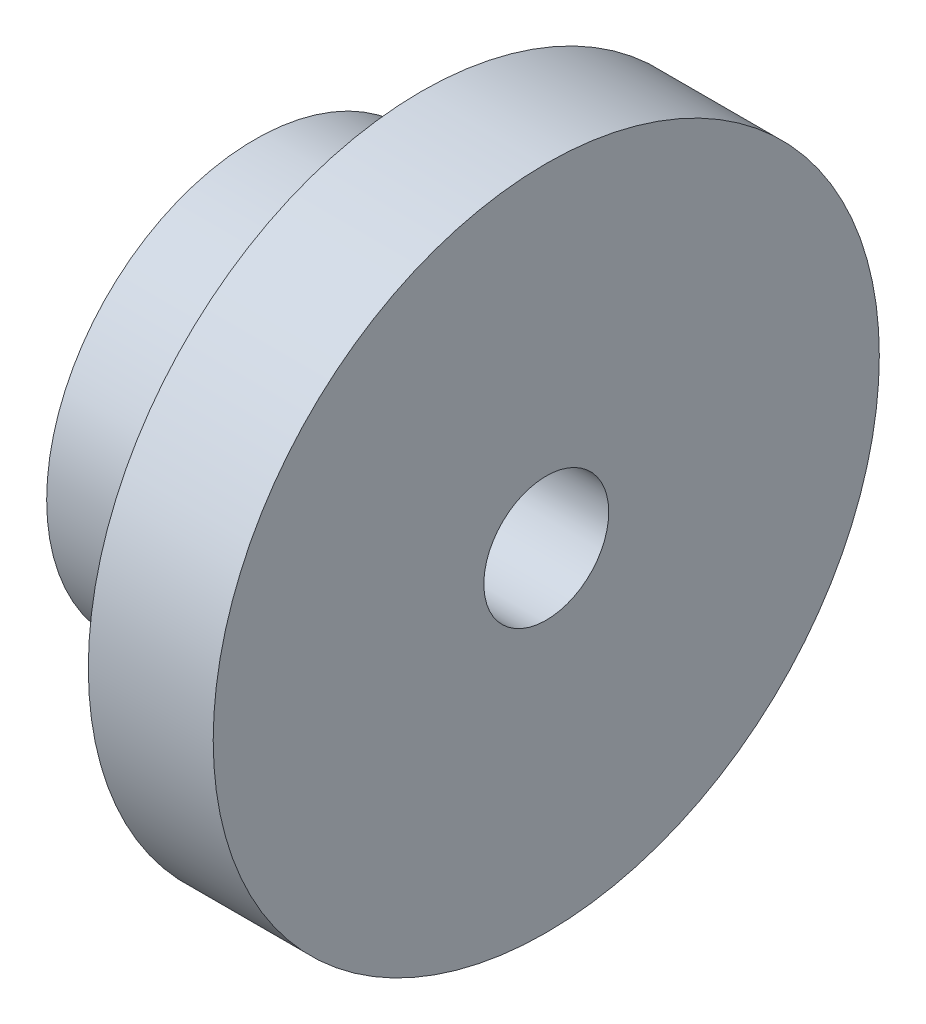
ISO-10303-21;
HEADER;
FILE_DESCRIPTION(('STEP AP214'),'2;1');
FILE_NAME('part.step','',(''),(''),'','','');
FILE_SCHEMA(('AUTOMOTIVE_DESIGN { 1 0 10303 214 1 1 1 1 }'));
ENDSEC;
DATA;
#1=APPLICATION_CONTEXT('core data for automotive mechanical design processes');
#2=APPLICATION_PROTOCOL_DEFINITION('international standard','automotive_design',2000,#1);
#3=PRODUCT_CONTEXT('',#1,'mechanical');
#4=PRODUCT('Part','Part','',(#3));
#5=PRODUCT_RELATED_PRODUCT_CATEGORY('part','',(#4));
#6=PRODUCT_DEFINITION_FORMATION('','',#4);
#7=PRODUCT_DEFINITION_CONTEXT('part definition',#1,'design');
#8=PRODUCT_DEFINITION('design','',#6,#7);
#9=PRODUCT_DEFINITION_SHAPE('','',#8);
#10=(LENGTH_UNIT() NAMED_UNIT(*) SI_UNIT(.MILLI.,.METRE.));
#11=(NAMED_UNIT(*) PLANE_ANGLE_UNIT() SI_UNIT($,.RADIAN.));
#12=(NAMED_UNIT(*) SI_UNIT($,.STERADIAN.) SOLID_ANGLE_UNIT());
#13=UNCERTAINTY_MEASURE_WITH_UNIT(LENGTH_MEASURE(1.E-05),#10,'distance_accuracy_value','');
#14=(GEOMETRIC_REPRESENTATION_CONTEXT(3) GLOBAL_UNCERTAINTY_ASSIGNED_CONTEXT((#13)) GLOBAL_UNIT_ASSIGNED_CONTEXT((#10,
#11,#12)) REPRESENTATION_CONTEXT('',''));
#15=CARTESIAN_POINT('',(0.,0.,0.));
#16=DIRECTION('',(0.,0.,1.));
#17=DIRECTION('',(1.,0.,0.));
#18=AXIS2_PLACEMENT_3D('',#15,#16,#17);
#19=CARTESIAN_POINT('',(0.,0.,0.));
#20=DIRECTION('',(1.,0.,0.));
#21=DIRECTION('',(0.,0.,-1.));
#22=AXIS2_PLACEMENT_3D('',#19,#20,#21);
#23=PLANE('',#22);
#24=CARTESIAN_POINT('',(0.,0.,0.));
#25=DIRECTION('',(1.,0.,0.));
#26=DIRECTION('',(0.,0.,-1.));
#27=AXIS2_PLACEMENT_3D('',#24,#25,#26);
#28=CIRCLE('',#27,12.7);
#29=CARTESIAN_POINT('',(0.,0.,12.7));
#30=VERTEX_POINT('',#29);
#31=EDGE_CURVE('E42',#30,#30,#28,.T.);
#32=ORIENTED_EDGE('',*,*,#31,.F.);
#33=EDGE_LOOP('',(#32));
#34=FACE_BOUND('',#33,.T.);
#35=CARTESIAN_POINT('',(0.,0.,0.));
#36=DIRECTION('',(1.,0.,0.));
#37=DIRECTION('',(0.,0.,-1.));
#38=AXIS2_PLACEMENT_3D('',#35,#36,#37);
#39=CIRCLE('',#38,7.9375);
#40=CARTESIAN_POINT('',(0.,0.,-7.9375));
#41=VERTEX_POINT('',#40);
#42=EDGE_CURVE('E10',#41,#41,#39,.F.);
#43=ORIENTED_EDGE('',*,*,#42,.F.);
#44=EDGE_LOOP('',(#43));
#45=FACE_BOUND('',#44,.T.);
#46=ADVANCED_FACE('F31',(#34,#45),#23,.F.);
#47=CARTESIAN_POINT('',(4.7625,0.,0.));
#48=DIRECTION('',(-1.,0.,0.));
#49=DIRECTION('',(0.,0.,1.));
#50=AXIS2_PLACEMENT_3D('',#47,#48,#49);
#51=CYLINDRICAL_SURFACE('',#50,12.7);
#52=CARTESIAN_POINT('',(4.7625,0.,0.));
#53=DIRECTION('',(1.,0.,0.));
#54=DIRECTION('',(0.,0.,-1.));
#55=AXIS2_PLACEMENT_3D('',#52,#53,#54);
#56=CIRCLE('',#55,12.7);
#57=CARTESIAN_POINT('',(4.7625,0.,12.7));
#58=VERTEX_POINT('',#57);
#59=EDGE_CURVE('E38',#58,#58,#56,.T.);
#60=CARTESIAN_POINT('',(4.7625,0.,12.7));
#61=CARTESIAN_POINT('',(4.712890625,0.,12.7));
#62=CARTESIAN_POINT('',(4.66328125,0.,12.7));
#63=CARTESIAN_POINT('',(4.5640625,0.,12.7));
#64=CARTESIAN_POINT('',(4.514453125,0.,12.7));
#65=CARTESIAN_POINT('',(4.415234375,0.,12.7));
#66=CARTESIAN_POINT('',(4.365625,0.,12.7));
#67=CARTESIAN_POINT('',(4.26640625,0.,12.7));
#68=CARTESIAN_POINT('',(4.216796875,0.,12.7));
#69=CARTESIAN_POINT('',(4.117578125,0.,12.7));
#70=CARTESIAN_POINT('',(4.06796875,0.,12.7));
#71=CARTESIAN_POINT('',(3.96875,0.,12.7));
#72=CARTESIAN_POINT('',(3.919140625,0.,12.7));
#73=CARTESIAN_POINT('',(3.819921875,0.,12.7));
#74=CARTESIAN_POINT('',(3.7703125,0.,12.7));
#75=CARTESIAN_POINT('',(3.67109375,0.,12.7));
#76=CARTESIAN_POINT('',(3.621484375,0.,12.7));
#77=CARTESIAN_POINT('',(3.522265625,0.,12.7));
#78=CARTESIAN_POINT('',(3.47265625,0.,12.7));
#79=CARTESIAN_POINT('',(3.3734375,0.,12.7));
#80=CARTESIAN_POINT('',(3.323828125,0.,12.7));
#81=CARTESIAN_POINT('',(3.224609375,0.,12.7));
#82=CARTESIAN_POINT('',(3.175,0.,12.7));
#83=CARTESIAN_POINT('',(3.07578125,0.,12.7));
#84=CARTESIAN_POINT('',(3.026171875,0.,12.7));
#85=CARTESIAN_POINT('',(2.926953125,0.,12.7));
#86=CARTESIAN_POINT('',(2.87734375,0.,12.7));
#87=CARTESIAN_POINT('',(2.778125,0.,12.7));
#88=CARTESIAN_POINT('',(2.728515625,0.,12.7));
#89=CARTESIAN_POINT('',(2.629296875,0.,12.7));
#90=CARTESIAN_POINT('',(2.5796875,0.,12.7));
#91=CARTESIAN_POINT('',(2.48046875,0.,12.7));
#92=CARTESIAN_POINT('',(2.430859375,0.,12.7));
#93=CARTESIAN_POINT('',(2.331640625,0.,12.7));
#94=CARTESIAN_POINT('',(2.28203125,0.,12.7));
#95=CARTESIAN_POINT('',(2.1828125,0.,12.7));
#96=CARTESIAN_POINT('',(2.133203125,0.,12.7));
#97=CARTESIAN_POINT('',(2.033984375,0.,12.7));
#98=CARTESIAN_POINT('',(1.984375,0.,12.7));
#99=CARTESIAN_POINT('',(1.88515625,0.,12.7));
#100=CARTESIAN_POINT('',(1.835546875,0.,12.7));
#101=CARTESIAN_POINT('',(1.736328125,0.,12.7));
#102=CARTESIAN_POINT('',(1.68671875,0.,12.7));
#103=CARTESIAN_POINT('',(1.5875,0.,12.7));
#104=CARTESIAN_POINT('',(1.537890625,0.,12.7));
#105=CARTESIAN_POINT('',(1.438671875,0.,12.7));
#106=CARTESIAN_POINT('',(1.3890625,0.,12.7));
#107=CARTESIAN_POINT('',(1.28984375,0.,12.7));
#108=CARTESIAN_POINT('',(1.240234375,0.,12.7));
#109=CARTESIAN_POINT('',(1.141015625,0.,12.7));
#110=CARTESIAN_POINT('',(1.09140625,0.,12.7));
#111=CARTESIAN_POINT('',(0.9921875,0.,12.7));
#112=CARTESIAN_POINT('',(0.942578125,0.,12.7));
#113=CARTESIAN_POINT('',(0.843359375,0.,12.7));
#114=CARTESIAN_POINT('',(0.79375,0.,12.7));
#115=CARTESIAN_POINT('',(0.69453125,0.,12.7));
#116=CARTESIAN_POINT('',(0.644921875,0.,12.7));
#117=CARTESIAN_POINT('',(0.545703125,0.,12.7));
#118=CARTESIAN_POINT('',(0.49609375,0.,12.7));
#119=CARTESIAN_POINT('',(0.396875,0.,12.7));
#120=CARTESIAN_POINT('',(0.347265625,0.,12.7));
#121=CARTESIAN_POINT('',(0.248046875,0.,12.7));
#122=CARTESIAN_POINT('',(0.1984375,0.,12.7));
#123=CARTESIAN_POINT('',(0.09921875,0.,12.7));
#124=CARTESIAN_POINT('',(0.049609375,0.,12.7));
#125=CARTESIAN_POINT('',(0.,0.,12.7));
#126=B_SPLINE_CURVE_WITH_KNOTS('',3,(#60,#61,#62,#63,#64,#65,#66,#67,#68,#69,#70,#71,#72,#73,
#74,#75,#76,#77,#78,#79,#80,#81,#82,#83,#84,#85,#86,#87,#88,#89,#90,#91,#92,#93,#94,#95,#96,#97,
#98,#99,#100,#101,#102,#103,#104,#105,#106,#107,#108,#109,#110,#111,#112,#113,#114,#115,#116,
#117,#118,#119,#120,#121,#122,#123,#124,#125),.UNSPECIFIED.,.F.,.F.,(4,2,2,2,2,2,2,2,2,2,2,2,2,
2,2,2,2,2,2,2,2,2,2,2,2,2,2,2,2,2,2,2,4),(0.,0.148828124999999,0.297656249999999,
0.446484374999999,0.595312499999999,0.744140625,0.89296875,1.041796875,1.190625,1.339453125,
1.48828125,1.637109375,1.7859375,1.934765625,2.08359375,2.232421875,2.38125,2.530078125,
2.67890625,2.827734375,2.9765625,3.125390625,3.27421875,3.423046875,3.571875,3.720703125,
3.86953125,4.018359375,4.1671875,4.316015625,4.46484375,4.613671875,4.7625),.UNSPECIFIED.);
#127=EDGE_CURVE('BSEAM33',#58,#30,#126,.T.);
#128=ORIENTED_EDGE('',*,*,#59,.F.);
#129=ORIENTED_EDGE('',*,*,#31,.T.);
#130=ORIENTED_EDGE('',*,*,#127,.T.);
#131=ORIENTED_EDGE('',*,*,#127,.F.);
#132=EDGE_LOOP('',(#128,#130,#129,#131));
#133=FACE_BOUND('',#132,.T.);
#134=ADVANCED_FACE('F33',(#133),#51,.T.);
#135=CARTESIAN_POINT('',(4.7625,0.,0.));
#136=DIRECTION('',(1.,0.,0.));
#137=DIRECTION('',(0.,0.,-1.));
#138=AXIS2_PLACEMENT_3D('',#135,#136,#137);
#139=PLANE('',#138);
#140=CARTESIAN_POINT('',(4.7625,0.,0.));
#141=DIRECTION('',(1.,0.,0.));
#142=DIRECTION('',(0.,0.,-1.));
#143=AXIS2_PLACEMENT_3D('',#140,#141,#142);
#144=CIRCLE('',#143,2.38124999999999);
#145=CARTESIAN_POINT('',(4.7625,0.,-2.38124999999999));
#146=VERTEX_POINT('',#145);
#147=EDGE_CURVE('E54',#146,#146,#144,.T.);
#148=ORIENTED_EDGE('',*,*,#147,.F.);
#149=EDGE_LOOP('',(#148));
#150=FACE_BOUND('',#149,.T.);
#151=ORIENTED_EDGE('',*,*,#59,.T.);
#152=EDGE_LOOP('',(#151));
#153=FACE_BOUND('',#152,.T.);
#154=ADVANCED_FACE('F60',(#150,#153),#139,.T.);
#155=CARTESIAN_POINT('',(-6.35,0.,0.));
#156=DIRECTION('',(1.,0.,0.));
#157=DIRECTION('',(0.,0.,-1.));
#158=AXIS2_PLACEMENT_3D('',#155,#156,#157);
#159=CYLINDRICAL_SURFACE('',#158,7.9375);
#160=CARTESIAN_POINT('',(-6.35,0.,0.));
#161=DIRECTION('',(-1.,0.,0.));
#162=DIRECTION('',(0.,0.,1.));
#163=AXIS2_PLACEMENT_3D('',#160,#161,#162);
#164=CIRCLE('',#163,7.9375);
#165=CARTESIAN_POINT('',(-6.35,0.,7.9375));
#166=VERTEX_POINT('',#165);
#167=EDGE_CURVE('E47',#166,#166,#164,.T.);
#168=ORIENTED_EDGE('',*,*,#167,.F.);
#169=EDGE_LOOP('',(#168));
#170=FACE_BOUND('',#169,.T.);
#171=ORIENTED_EDGE('',*,*,#42,.T.);
#172=EDGE_LOOP('',(#171));
#173=FACE_BOUND('',#172,.T.);
#174=ADVANCED_FACE('F62',(#170,#173),#159,.T.);
#175=CARTESIAN_POINT('',(-6.35,0.,0.));
#176=DIRECTION('',(-1.,0.,0.));
#177=DIRECTION('',(0.,0.,1.));
#178=AXIS2_PLACEMENT_3D('',#175,#176,#177);
#179=PLANE('',#178);
#180=CARTESIAN_POINT('',(-6.35,0.,0.));
#181=DIRECTION('',(1.,0.,0.));
#182=DIRECTION('',(0.,0.,-1.));
#183=AXIS2_PLACEMENT_3D('',#180,#181,#182);
#184=CIRCLE('',#183,2.38125);
#185=CARTESIAN_POINT('',(-6.35,0.,-2.38125));
#186=VERTEX_POINT('',#185);
#187=EDGE_CURVE('E51',#186,#186,#184,.T.);
#188=ORIENTED_EDGE('',*,*,#187,.T.);
#189=EDGE_LOOP('',(#188));
#190=FACE_BOUND('',#189,.T.);
#191=ORIENTED_EDGE('',*,*,#167,.T.);
#192=EDGE_LOOP('',(#191));
#193=FACE_BOUND('',#192,.T.);
#194=ADVANCED_FACE('F68',(#190,#193),#179,.T.);
#195=CARTESIAN_POINT('',(4.7625,0.,0.));
#196=DIRECTION('',(1.,0.,0.));
#197=DIRECTION('',(0.,0.,-1.));
#198=AXIS2_PLACEMENT_3D('',#195,#196,#197);
#199=CYLINDRICAL_SURFACE('',#198,2.38124999999999);
#200=ORIENTED_EDGE('',*,*,#187,.F.);
#201=EDGE_LOOP('',(#200));
#202=FACE_BOUND('',#201,.T.);
#203=ORIENTED_EDGE('',*,*,#147,.T.);
#204=EDGE_LOOP('',(#203));
#205=FACE_BOUND('',#204,.T.);
#206=ADVANCED_FACE('F58',(#202,#205),#199,.F.);
#207=CLOSED_SHELL('',(#46,#134,#154,#174,#194,#206));
#208=MANIFOLD_SOLID_BREP('B2',#207);
#209=ADVANCED_BREP_SHAPE_REPRESENTATION('',(#18,#208),#14);
#210=SHAPE_DEFINITION_REPRESENTATION(#9,#209);
ENDSEC;
END-ISO-10303-21;
